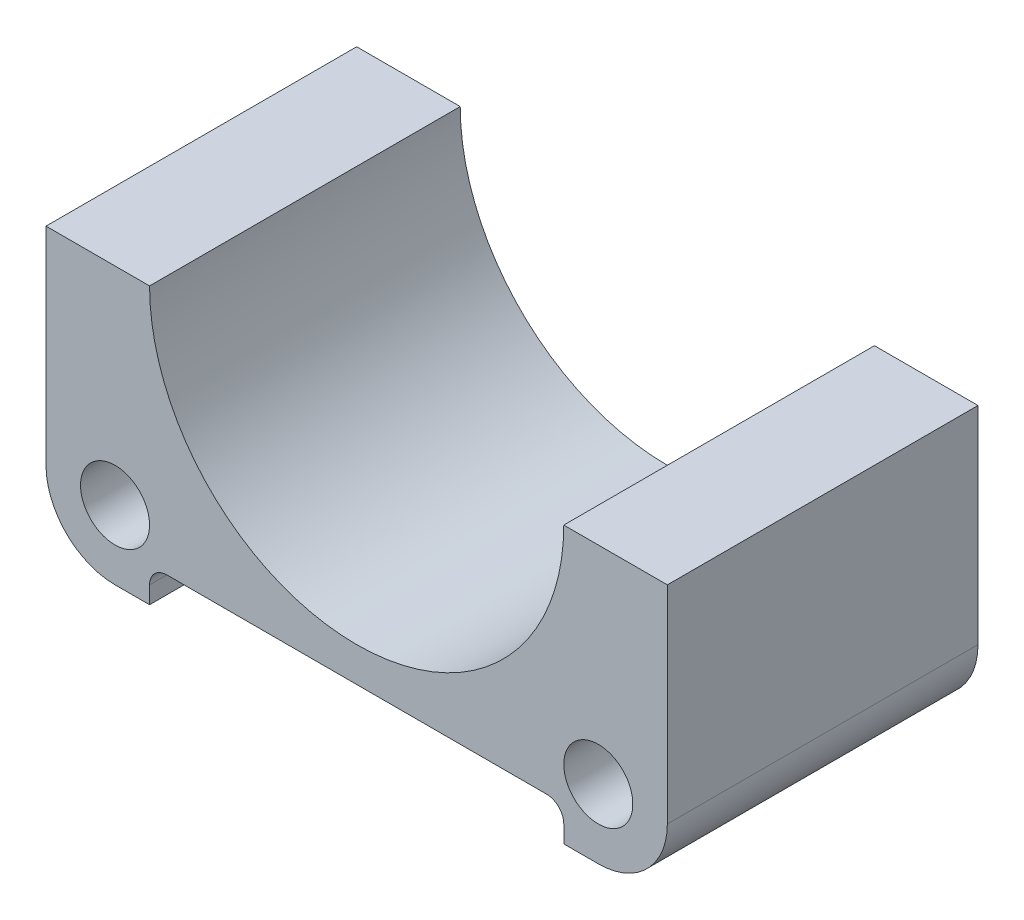
ISO-10303-21;
HEADER;
FILE_DESCRIPTION(('STEP AP214'),'2;1');
FILE_NAME('part.step','',(''),(''),'','','');
FILE_SCHEMA(('AUTOMOTIVE_DESIGN { 1 0 10303 214 1 1 1 1 }'));
ENDSEC;
DATA;
#1=APPLICATION_CONTEXT('core data for automotive mechanical design processes');
#2=APPLICATION_PROTOCOL_DEFINITION('international standard','automotive_design',2000,#1);
#3=PRODUCT_CONTEXT('',#1,'mechanical');
#4=PRODUCT('Part','Part','',(#3));
#5=PRODUCT_RELATED_PRODUCT_CATEGORY('part','',(#4));
#6=PRODUCT_DEFINITION_FORMATION('','',#4);
#7=PRODUCT_DEFINITION_CONTEXT('part definition',#1,'design');
#8=PRODUCT_DEFINITION('design','',#6,#7);
#9=PRODUCT_DEFINITION_SHAPE('','',#8);
#10=(LENGTH_UNIT() NAMED_UNIT(*) SI_UNIT(.MILLI.,.METRE.));
#11=(NAMED_UNIT(*) PLANE_ANGLE_UNIT() SI_UNIT($,.RADIAN.));
#12=(NAMED_UNIT(*) SI_UNIT($,.STERADIAN.) SOLID_ANGLE_UNIT());
#13=UNCERTAINTY_MEASURE_WITH_UNIT(LENGTH_MEASURE(1.E-05),#10,'distance_accuracy_value','');
#14=(GEOMETRIC_REPRESENTATION_CONTEXT(3) GLOBAL_UNCERTAINTY_ASSIGNED_CONTEXT((#13)) GLOBAL_UNIT_ASSIGNED_CONTEXT((#10,
#11,#12)) REPRESENTATION_CONTEXT('',''));
#15=CARTESIAN_POINT('',(0.,0.,0.));
#16=DIRECTION('',(0.,0.,1.));
#17=DIRECTION('',(1.,0.,0.));
#18=AXIS2_PLACEMENT_3D('',#15,#16,#17);
#19=CARTESIAN_POINT('',(0.,40.,90.));
#20=DIRECTION('',(0.,0.,1.));
#21=DIRECTION('',(1.,0.,0.));
#22=AXIS2_PLACEMENT_3D('',#19,#20,#21);
#23=PLANE('',#22);
#24=CARTESIAN_POINT('',(-70.,-20.,90.));
#25=DIRECTION('',(0.,0.,1.));
#26=DIRECTION('',(1.,0.,0.));
#27=AXIS2_PLACEMENT_3D('',#24,#25,#26);
#28=CIRCLE('',#27,10.);
#29=CARTESIAN_POINT('',(-80.,-20.,90.));
#30=VERTEX_POINT('',#29);
#31=EDGE_CURVE('E174',#30,#30,#28,.T.);
#32=ORIENTED_EDGE('',*,*,#31,.F.);
#33=EDGE_LOOP('',(#32));
#34=FACE_BOUND('',#33,.T.);
#35=DIRECTION('',(0.,1.,0.));
#36=VECTOR('',#35,1.);
#37=CARTESIAN_POINT('',(90.,-19.9999999999999,90.));
#38=LINE('',#37,#36);
#39=CARTESIAN_POINT('',(90.,-20.,90.));
#40=VERTEX_POINT('',#39);
#41=CARTESIAN_POINT('',(90.,40.,90.));
#42=VERTEX_POINT('',#41);
#43=EDGE_CURVE('E197',#40,#42,#38,.T.);
#44=ORIENTED_EDGE('',*,*,#43,.T.);
#45=DIRECTION('',(-1.,0.,0.));
#46=VECTOR('',#45,1.);
#47=CARTESIAN_POINT('',(60.,40.,90.));
#48=LINE('',#47,#46);
#49=CARTESIAN_POINT('',(60.,40.,90.));
#50=VERTEX_POINT('',#49);
#51=EDGE_CURVE('E115',#42,#50,#48,.T.);
#52=ORIENTED_EDGE('',*,*,#51,.T.);
#53=CARTESIAN_POINT('',(0.,40.,90.));
#54=DIRECTION('',(0.,0.,-1.));
#55=DIRECTION('',(1.,0.,0.));
#56=AXIS2_PLACEMENT_3D('',#53,#54,#55);
#57=CIRCLE('',#56,60.);
#58=CARTESIAN_POINT('',(-60.,40.,90.));
#59=VERTEX_POINT('',#58);
#60=EDGE_CURVE('E230',#50,#59,#57,.T.);
#61=ORIENTED_EDGE('',*,*,#60,.T.);
#62=DIRECTION('',(-1.,0.,0.));
#63=VECTOR('',#62,1.);
#64=CARTESIAN_POINT('',(-90.,40.,90.));
#65=LINE('',#64,#63);
#66=CARTESIAN_POINT('',(-90.,40.,90.));
#67=VERTEX_POINT('',#66);
#68=EDGE_CURVE('E249',#59,#67,#65,.T.);
#69=ORIENTED_EDGE('',*,*,#68,.T.);
#70=DIRECTION('',(0.,-1.,0.));
#71=VECTOR('',#70,1.);
#72=CARTESIAN_POINT('',(-90.,-19.9999999999999,90.));
#73=LINE('',#72,#71);
#74=CARTESIAN_POINT('',(-90.,-19.9999999999999,90.));
#75=VERTEX_POINT('',#74);
#76=EDGE_CURVE('E246',#67,#75,#73,.T.);
#77=ORIENTED_EDGE('',*,*,#76,.T.);
#78=CARTESIAN_POINT('',(-70.,-20.,90.));
#79=DIRECTION('',(0.,0.,1.));
#80=DIRECTION('',(-1.,0.,0.));
#81=AXIS2_PLACEMENT_3D('',#78,#79,#80);
#82=CIRCLE('',#81,20.);
#83=CARTESIAN_POINT('',(-69.9999999999998,-40.,90.));
#84=VERTEX_POINT('',#83);
#85=EDGE_CURVE('E248',#75,#84,#82,.T.);
#86=ORIENTED_EDGE('',*,*,#85,.T.);
#87=DIRECTION('',(1.,0.,0.));
#88=VECTOR('',#87,1.);
#89=CARTESIAN_POINT('',(-69.9999999999998,-40.,90.));
#90=LINE('',#89,#88);
#91=CARTESIAN_POINT('',(-60.,-40.,90.));
#92=VERTEX_POINT('',#91);
#93=EDGE_CURVE('E251',#84,#92,#90,.T.);
#94=ORIENTED_EDGE('',*,*,#93,.T.);
#95=DIRECTION('',(0.,1.,0.));
#96=VECTOR('',#95,1.);
#97=CARTESIAN_POINT('',(-60.,-40.,90.));
#98=LINE('',#97,#96);
#99=CARTESIAN_POINT('',(-60.,-35.,90.));
#100=VERTEX_POINT('',#99);
#101=EDGE_CURVE('E257',#92,#100,#98,.T.);
#102=ORIENTED_EDGE('',*,*,#101,.T.);
#103=CARTESIAN_POINT('',(-55.,-35.,90.));
#104=DIRECTION('',(0.,0.,-1.));
#105=DIRECTION('',(-1.,0.,0.));
#106=AXIS2_PLACEMENT_3D('',#103,#104,#105);
#107=CIRCLE('',#106,5.);
#108=CARTESIAN_POINT('',(-55.,-30.,90.));
#109=VERTEX_POINT('',#108);
#110=EDGE_CURVE('E259',#100,#109,#107,.T.);
#111=ORIENTED_EDGE('',*,*,#110,.T.);
#112=DIRECTION('',(1.,0.,0.));
#113=VECTOR('',#112,1.);
#114=CARTESIAN_POINT('',(-55.,-30.,90.));
#115=LINE('',#114,#113);
#116=CARTESIAN_POINT('',(55.,-30.,90.));
#117=VERTEX_POINT('',#116);
#118=EDGE_CURVE('E261',#109,#117,#115,.T.);
#119=ORIENTED_EDGE('',*,*,#118,.T.);
#120=CARTESIAN_POINT('',(55.,-35.,90.));
#121=DIRECTION('',(0.,0.,-1.));
#122=DIRECTION('',(-1.,0.,0.));
#123=AXIS2_PLACEMENT_3D('',#120,#121,#122);
#124=CIRCLE('',#123,5.00000000000001);
#125=CARTESIAN_POINT('',(60.,-35.,90.));
#126=VERTEX_POINT('',#125);
#127=EDGE_CURVE('E152',#117,#126,#124,.T.);
#128=ORIENTED_EDGE('',*,*,#127,.T.);
#129=DIRECTION('',(0.,-1.,0.));
#130=VECTOR('',#129,1.);
#131=CARTESIAN_POINT('',(60.,-35.,90.));
#132=LINE('',#131,#130);
#133=CARTESIAN_POINT('',(60.,-40.,90.));
#134=VERTEX_POINT('',#133);
#135=EDGE_CURVE('E146',#126,#134,#132,.T.);
#136=ORIENTED_EDGE('',*,*,#135,.T.);
#137=DIRECTION('',(1.,0.,0.));
#138=VECTOR('',#137,1.);
#139=CARTESIAN_POINT('',(60.,-40.,90.));
#140=LINE('',#139,#138);
#141=CARTESIAN_POINT('',(69.9999999999999,-40.,90.));
#142=VERTEX_POINT('',#141);
#143=EDGE_CURVE('E150',#134,#142,#140,.T.);
#144=ORIENTED_EDGE('',*,*,#143,.T.);
#145=CARTESIAN_POINT('',(70.,-20.,90.));
#146=DIRECTION('',(0.,0.,1.));
#147=DIRECTION('',(1.,0.,0.));
#148=AXIS2_PLACEMENT_3D('',#145,#146,#147);
#149=CIRCLE('',#148,20.);
#150=EDGE_CURVE('E54',#142,#40,#149,.T.);
#151=ORIENTED_EDGE('',*,*,#150,.T.);
#152=EDGE_LOOP('',(#44,#52,#61,#69,#77,#86,#94,#102,#111,#119,#128,#136,#144,#151));
#153=FACE_BOUND('',#152,.T.);
#154=CARTESIAN_POINT('',(70.,-20.,90.));
#155=DIRECTION('',(0.,0.,1.));
#156=DIRECTION('',(1.,0.,0.));
#157=AXIS2_PLACEMENT_3D('',#154,#155,#156);
#158=CIRCLE('',#157,9.99999999999999);
#159=CARTESIAN_POINT('',(60.,-20.,90.));
#160=VERTEX_POINT('',#159);
#161=EDGE_CURVE('E303',#160,#160,#158,.T.);
#162=ORIENTED_EDGE('',*,*,#161,.F.);
#163=EDGE_LOOP('',(#162));
#164=FACE_BOUND('',#163,.T.);
#165=ADVANCED_FACE('F37',(#34,#153,#164),#23,.T.);
#166=CARTESIAN_POINT('',(0.,40.,0.));
#167=DIRECTION('',(0.,0.,1.));
#168=DIRECTION('',(1.,0.,0.));
#169=AXIS2_PLACEMENT_3D('',#166,#167,#168);
#170=PLANE('',#169);
#171=DIRECTION('',(0.,1.,0.));
#172=VECTOR('',#171,1.);
#173=CARTESIAN_POINT('',(90.,-19.9999999999999,0.));
#174=LINE('',#173,#172);
#175=CARTESIAN_POINT('',(90.,-20.,0.));
#176=VERTEX_POINT('',#175);
#177=CARTESIAN_POINT('',(90.,40.,0.));
#178=VERTEX_POINT('',#177);
#179=EDGE_CURVE('E170',#176,#178,#174,.T.);
#180=ORIENTED_EDGE('',*,*,#179,.F.);
#181=CARTESIAN_POINT('',(70.,-20.,0.));
#182=DIRECTION('',(0.,0.,1.));
#183=DIRECTION('',(1.,0.,0.));
#184=AXIS2_PLACEMENT_3D('',#181,#182,#183);
#185=CIRCLE('',#184,20.);
#186=CARTESIAN_POINT('',(69.9999999999999,-40.,0.));
#187=VERTEX_POINT('',#186);
#188=EDGE_CURVE('E107',#187,#176,#185,.T.);
#189=ORIENTED_EDGE('',*,*,#188,.F.);
#190=DIRECTION('',(1.,0.,0.));
#191=VECTOR('',#190,1.);
#192=CARTESIAN_POINT('',(60.,-40.,0.));
#193=LINE('',#192,#191);
#194=CARTESIAN_POINT('',(60.,-40.,0.));
#195=VERTEX_POINT('',#194);
#196=EDGE_CURVE('E101',#195,#187,#193,.T.);
#197=ORIENTED_EDGE('',*,*,#196,.F.);
#198=DIRECTION('',(0.,-1.,0.));
#199=VECTOR('',#198,1.);
#200=CARTESIAN_POINT('',(60.,-35.,0.));
#201=LINE('',#200,#199);
#202=CARTESIAN_POINT('',(60.,-35.,0.));
#203=VERTEX_POINT('',#202);
#204=EDGE_CURVE('E160',#203,#195,#201,.T.);
#205=ORIENTED_EDGE('',*,*,#204,.F.);
#206=CARTESIAN_POINT('',(55.,-35.,0.));
#207=DIRECTION('',(0.,0.,-1.));
#208=DIRECTION('',(-1.,0.,0.));
#209=AXIS2_PLACEMENT_3D('',#206,#207,#208);
#210=CIRCLE('',#209,5.00000000000001);
#211=CARTESIAN_POINT('',(55.,-30.,0.));
#212=VERTEX_POINT('',#211);
#213=EDGE_CURVE('E192',#212,#203,#210,.T.);
#214=ORIENTED_EDGE('',*,*,#213,.F.);
#215=DIRECTION('',(1.,0.,0.));
#216=VECTOR('',#215,1.);
#217=CARTESIAN_POINT('',(-55.,-30.,0.));
#218=LINE('',#217,#216);
#219=CARTESIAN_POINT('',(-55.,-30.,0.));
#220=VERTEX_POINT('',#219);
#221=EDGE_CURVE('E190',#220,#212,#218,.T.);
#222=ORIENTED_EDGE('',*,*,#221,.F.);
#223=CARTESIAN_POINT('',(-55.,-35.,0.));
#224=DIRECTION('',(0.,0.,-1.));
#225=DIRECTION('',(-1.,0.,0.));
#226=AXIS2_PLACEMENT_3D('',#223,#224,#225);
#227=CIRCLE('',#226,5.);
#228=CARTESIAN_POINT('',(-60.,-35.,0.));
#229=VERTEX_POINT('',#228);
#230=EDGE_CURVE('E188',#229,#220,#227,.T.);
#231=ORIENTED_EDGE('',*,*,#230,.F.);
#232=DIRECTION('',(0.,1.,0.));
#233=VECTOR('',#232,1.);
#234=CARTESIAN_POINT('',(-60.,-40.,0.));
#235=LINE('',#234,#233);
#236=CARTESIAN_POINT('',(-60.,-40.,0.));
#237=VERTEX_POINT('',#236);
#238=EDGE_CURVE('E186',#237,#229,#235,.T.);
#239=ORIENTED_EDGE('',*,*,#238,.F.);
#240=DIRECTION('',(1.,0.,0.));
#241=VECTOR('',#240,1.);
#242=CARTESIAN_POINT('',(-69.9999999999998,-40.,0.));
#243=LINE('',#242,#241);
#244=CARTESIAN_POINT('',(-69.9999999999998,-40.,0.));
#245=VERTEX_POINT('',#244);
#246=EDGE_CURVE('E184',#245,#237,#243,.T.);
#247=ORIENTED_EDGE('',*,*,#246,.F.);
#248=CARTESIAN_POINT('',(-70.,-20.,0.));
#249=DIRECTION('',(0.,0.,1.));
#250=DIRECTION('',(-1.,0.,0.));
#251=AXIS2_PLACEMENT_3D('',#248,#249,#250);
#252=CIRCLE('',#251,20.);
#253=CARTESIAN_POINT('',(-90.,-19.9999999999999,0.));
#254=VERTEX_POINT('',#253);
#255=EDGE_CURVE('E182',#254,#245,#252,.T.);
#256=ORIENTED_EDGE('',*,*,#255,.F.);
#257=DIRECTION('',(0.,-1.,0.));
#258=VECTOR('',#257,1.);
#259=CARTESIAN_POINT('',(-90.,-19.9999999999999,0.));
#260=LINE('',#259,#258);
#261=CARTESIAN_POINT('',(-90.,40.,0.));
#262=VERTEX_POINT('',#261);
#263=EDGE_CURVE('E180',#262,#254,#260,.T.);
#264=ORIENTED_EDGE('',*,*,#263,.F.);
#265=DIRECTION('',(-1.,0.,0.));
#266=VECTOR('',#265,1.);
#267=CARTESIAN_POINT('',(-90.,40.,0.));
#268=LINE('',#267,#266);
#269=CARTESIAN_POINT('',(-60.,40.,0.));
#270=VERTEX_POINT('',#269);
#271=EDGE_CURVE('E178',#270,#262,#268,.T.);
#272=ORIENTED_EDGE('',*,*,#271,.F.);
#273=CARTESIAN_POINT('',(0.,40.,0.));
#274=DIRECTION('',(0.,0.,-1.));
#275=DIRECTION('',(1.,0.,0.));
#276=AXIS2_PLACEMENT_3D('',#273,#274,#275);
#277=CIRCLE('',#276,60.);
#278=CARTESIAN_POINT('',(60.,40.,0.));
#279=VERTEX_POINT('',#278);
#280=EDGE_CURVE('E176',#279,#270,#277,.T.);
#281=ORIENTED_EDGE('',*,*,#280,.F.);
#282=DIRECTION('',(-1.,0.,0.));
#283=VECTOR('',#282,1.);
#284=CARTESIAN_POINT('',(60.,40.,0.));
#285=LINE('',#284,#283);
#286=EDGE_CURVE('E173',#178,#279,#285,.T.);
#287=ORIENTED_EDGE('',*,*,#286,.F.);
#288=EDGE_LOOP('',(#180,#189,#197,#205,#214,#222,#231,#239,#247,#256,#264,#272,#281,#287));
#289=FACE_BOUND('',#288,.T.);
#290=CARTESIAN_POINT('',(-70.,-20.,0.));
#291=DIRECTION('',(0.,0.,1.));
#292=DIRECTION('',(1.,0.,0.));
#293=AXIS2_PLACEMENT_3D('',#290,#291,#292);
#294=CIRCLE('',#293,10.);
#295=CARTESIAN_POINT('',(-80.,-20.,0.));
#296=VERTEX_POINT('',#295);
#297=EDGE_CURVE('E309',#296,#296,#294,.T.);
#298=ORIENTED_EDGE('',*,*,#297,.T.);
#299=EDGE_LOOP('',(#298));
#300=FACE_BOUND('',#299,.T.);
#301=CARTESIAN_POINT('',(70.,-20.,0.));
#302=DIRECTION('',(0.,0.,1.));
#303=DIRECTION('',(1.,0.,0.));
#304=AXIS2_PLACEMENT_3D('',#301,#302,#303);
#305=CIRCLE('',#304,9.99999999999999);
#306=CARTESIAN_POINT('',(60.,-20.,0.));
#307=VERTEX_POINT('',#306);
#308=EDGE_CURVE('E306',#307,#307,#305,.T.);
#309=ORIENTED_EDGE('',*,*,#308,.T.);
#310=EDGE_LOOP('',(#309));
#311=FACE_BOUND('',#310,.T.);
#312=ADVANCED_FACE('F234',(#289,#300,#311),#170,.F.);
#313=CARTESIAN_POINT('',(90.,-19.9999999999999,90.));
#314=DIRECTION('',(-1.,0.,0.));
#315=DIRECTION('',(0.,0.,1.));
#316=AXIS2_PLACEMENT_3D('',#313,#314,#315);
#317=PLANE('',#316);
#318=ORIENTED_EDGE('',*,*,#179,.T.);
#319=DIRECTION('',(0.,0.,-1.));
#320=VECTOR('',#319,1.);
#321=CARTESIAN_POINT('',(90.,40.,90.));
#322=LINE('',#321,#320);
#323=EDGE_CURVE('E11',#42,#178,#322,.T.);
#324=ORIENTED_EDGE('',*,*,#323,.F.);
#325=ORIENTED_EDGE('',*,*,#43,.F.);
#326=DIRECTION('',(0.,0.,-1.));
#327=VECTOR('',#326,1.);
#328=CARTESIAN_POINT('',(90.,-20.,90.));
#329=LINE('',#328,#327);
#330=EDGE_CURVE('E166',#40,#176,#329,.T.);
#331=ORIENTED_EDGE('',*,*,#330,.T.);
#332=EDGE_LOOP('',(#318,#324,#325,#331));
#333=FACE_BOUND('',#332,.T.);
#334=ADVANCED_FACE('F39',(#333),#317,.F.);
#335=CARTESIAN_POINT('',(60.,40.,90.));
#336=DIRECTION('',(0.,-1.,0.));
#337=DIRECTION('',(0.,0.,-1.));
#338=AXIS2_PLACEMENT_3D('',#335,#336,#337);
#339=PLANE('',#338);
#340=ORIENTED_EDGE('',*,*,#286,.T.);
#341=DIRECTION('',(0.,0.,-1.));
#342=VECTOR('',#341,1.);
#343=CARTESIAN_POINT('',(60.,40.,90.));
#344=LINE('',#343,#342);
#345=EDGE_CURVE('E46',#50,#279,#344,.T.);
#346=ORIENTED_EDGE('',*,*,#345,.F.);
#347=ORIENTED_EDGE('',*,*,#51,.F.);
#348=ORIENTED_EDGE('',*,*,#323,.T.);
#349=EDGE_LOOP('',(#340,#346,#347,#348));
#350=FACE_BOUND('',#349,.T.);
#351=ADVANCED_FACE('F434',(#350),#339,.F.);
#352=CARTESIAN_POINT('',(0.,40.,90.));
#353=DIRECTION('',(0.,0.,-1.));
#354=DIRECTION('',(-1.,0.,0.));
#355=AXIS2_PLACEMENT_3D('',#352,#353,#354);
#356=CYLINDRICAL_SURFACE('',#355,60.);
#357=ORIENTED_EDGE('',*,*,#280,.T.);
#358=DIRECTION('',(0.,0.,-1.));
#359=VECTOR('',#358,1.);
#360=CARTESIAN_POINT('',(-60.,40.,90.));
#361=LINE('',#360,#359);
#362=EDGE_CURVE('E222',#59,#270,#361,.T.);
#363=ORIENTED_EDGE('',*,*,#362,.F.);
#364=ORIENTED_EDGE('',*,*,#60,.F.);
#365=ORIENTED_EDGE('',*,*,#345,.T.);
#366=EDGE_LOOP('',(#357,#363,#364,#365));
#367=FACE_BOUND('',#366,.T.);
#368=ADVANCED_FACE('F228',(#367),#356,.F.);
#369=CARTESIAN_POINT('',(-90.,40.,90.));
#370=DIRECTION('',(0.,-1.,0.));
#371=DIRECTION('',(0.,0.,-1.));
#372=AXIS2_PLACEMENT_3D('',#369,#370,#371);
#373=PLANE('',#372);
#374=ORIENTED_EDGE('',*,*,#271,.T.);
#375=DIRECTION('',(0.,0.,-1.));
#376=VECTOR('',#375,1.);
#377=CARTESIAN_POINT('',(-90.,40.,90.));
#378=LINE('',#377,#376);
#379=EDGE_CURVE('E219',#67,#262,#378,.T.);
#380=ORIENTED_EDGE('',*,*,#379,.F.);
#381=ORIENTED_EDGE('',*,*,#68,.F.);
#382=ORIENTED_EDGE('',*,*,#362,.T.);
#383=EDGE_LOOP('',(#374,#380,#381,#382));
#384=FACE_BOUND('',#383,.T.);
#385=ADVANCED_FACE('F240',(#384),#373,.F.);
#386=CARTESIAN_POINT('',(-90.,-19.9999999999999,90.));
#387=DIRECTION('',(1.,0.,0.));
#388=DIRECTION('',(0.,0.,-1.));
#389=AXIS2_PLACEMENT_3D('',#386,#387,#388);
#390=PLANE('',#389);
#391=ORIENTED_EDGE('',*,*,#263,.T.);
#392=DIRECTION('',(0.,0.,-1.));
#393=VECTOR('',#392,1.);
#394=CARTESIAN_POINT('',(-90.,-19.9999999999999,90.));
#395=LINE('',#394,#393);
#396=EDGE_CURVE('E216',#75,#254,#395,.T.);
#397=ORIENTED_EDGE('',*,*,#396,.F.);
#398=ORIENTED_EDGE('',*,*,#76,.F.);
#399=ORIENTED_EDGE('',*,*,#379,.T.);
#400=EDGE_LOOP('',(#391,#397,#398,#399));
#401=FACE_BOUND('',#400,.T.);
#402=ADVANCED_FACE('F244',(#401),#390,.F.);
#403=CARTESIAN_POINT('',(-70.,-20.,90.));
#404=DIRECTION('',(0.,0.,-1.));
#405=DIRECTION('',(-1.,0.,0.));
#406=AXIS2_PLACEMENT_3D('',#403,#404,#405);
#407=CYLINDRICAL_SURFACE('',#406,20.);
#408=ORIENTED_EDGE('',*,*,#255,.T.);
#409=DIRECTION('',(0.,0.,-1.));
#410=VECTOR('',#409,1.);
#411=CARTESIAN_POINT('',(-69.9999999999998,-40.,90.));
#412=LINE('',#411,#410);
#413=EDGE_CURVE('E213',#84,#245,#412,.T.);
#414=ORIENTED_EDGE('',*,*,#413,.F.);
#415=ORIENTED_EDGE('',*,*,#85,.F.);
#416=ORIENTED_EDGE('',*,*,#396,.T.);
#417=EDGE_LOOP('',(#408,#414,#415,#416));
#418=FACE_BOUND('',#417,.T.);
#419=ADVANCED_FACE('F395',(#418),#407,.T.);
#420=CARTESIAN_POINT('',(-69.9999999999998,-40.,90.));
#421=DIRECTION('',(0.,1.,0.));
#422=DIRECTION('',(0.,0.,1.));
#423=AXIS2_PLACEMENT_3D('',#420,#421,#422);
#424=PLANE('',#423);
#425=ORIENTED_EDGE('',*,*,#246,.T.);
#426=DIRECTION('',(0.,0.,-1.));
#427=VECTOR('',#426,1.);
#428=CARTESIAN_POINT('',(-60.,-40.,90.));
#429=LINE('',#428,#427);
#430=EDGE_CURVE('E210',#92,#237,#429,.T.);
#431=ORIENTED_EDGE('',*,*,#430,.F.);
#432=ORIENTED_EDGE('',*,*,#93,.F.);
#433=ORIENTED_EDGE('',*,*,#413,.T.);
#434=EDGE_LOOP('',(#425,#431,#432,#433));
#435=FACE_BOUND('',#434,.T.);
#436=ADVANCED_FACE('F384',(#435),#424,.F.);
#437=CARTESIAN_POINT('',(-60.,-40.,90.));
#438=DIRECTION('',(-1.,0.,0.));
#439=DIRECTION('',(0.,-1.,0.));
#440=AXIS2_PLACEMENT_3D('',#437,#438,#439);
#441=PLANE('',#440);
#442=ORIENTED_EDGE('',*,*,#238,.T.);
#443=DIRECTION('',(0.,0.,-1.));
#444=VECTOR('',#443,1.);
#445=CARTESIAN_POINT('',(-60.,-35.,90.));
#446=LINE('',#445,#444);
#447=EDGE_CURVE('E207',#100,#229,#446,.T.);
#448=ORIENTED_EDGE('',*,*,#447,.F.);
#449=ORIENTED_EDGE('',*,*,#101,.F.);
#450=ORIENTED_EDGE('',*,*,#430,.T.);
#451=EDGE_LOOP('',(#442,#448,#449,#450));
#452=FACE_BOUND('',#451,.T.);
#453=ADVANCED_FACE('F373',(#452),#441,.F.);
#454=CARTESIAN_POINT('',(-55.,-35.,90.));
#455=DIRECTION('',(0.,0.,-1.));
#456=DIRECTION('',(-1.,0.,0.));
#457=AXIS2_PLACEMENT_3D('',#454,#455,#456);
#458=CYLINDRICAL_SURFACE('',#457,5.);
#459=ORIENTED_EDGE('',*,*,#230,.T.);
#460=DIRECTION('',(0.,0.,-1.));
#461=VECTOR('',#460,1.);
#462=CARTESIAN_POINT('',(-55.,-30.,90.));
#463=LINE('',#462,#461);
#464=EDGE_CURVE('E204',#109,#220,#463,.T.);
#465=ORIENTED_EDGE('',*,*,#464,.F.);
#466=ORIENTED_EDGE('',*,*,#110,.F.);
#467=ORIENTED_EDGE('',*,*,#447,.T.);
#468=EDGE_LOOP('',(#459,#465,#466,#467));
#469=FACE_BOUND('',#468,.T.);
#470=ADVANCED_FACE('F363',(#469),#458,.F.);
#471=CARTESIAN_POINT('',(-55.,-30.,90.));
#472=DIRECTION('',(0.,1.,0.));
#473=DIRECTION('',(-1.,0.,0.));
#474=AXIS2_PLACEMENT_3D('',#471,#472,#473);
#475=PLANE('',#474);
#476=ORIENTED_EDGE('',*,*,#221,.T.);
#477=DIRECTION('',(0.,0.,-1.));
#478=VECTOR('',#477,1.);
#479=CARTESIAN_POINT('',(55.,-30.,90.));
#480=LINE('',#479,#478);
#481=EDGE_CURVE('E201',#117,#212,#480,.T.);
#482=ORIENTED_EDGE('',*,*,#481,.F.);
#483=ORIENTED_EDGE('',*,*,#118,.F.);
#484=ORIENTED_EDGE('',*,*,#464,.T.);
#485=EDGE_LOOP('',(#476,#482,#483,#484));
#486=FACE_BOUND('',#485,.T.);
#487=ADVANCED_FACE('F267',(#486),#475,.F.);
#488=CARTESIAN_POINT('',(55.,-35.,90.));
#489=DIRECTION('',(0.,0.,-1.));
#490=DIRECTION('',(-1.,0.,0.));
#491=AXIS2_PLACEMENT_3D('',#488,#489,#490);
#492=CYLINDRICAL_SURFACE('',#491,5.00000000000001);
#493=ORIENTED_EDGE('',*,*,#213,.T.);
#494=DIRECTION('',(0.,0.,-1.));
#495=VECTOR('',#494,1.);
#496=CARTESIAN_POINT('',(60.,-35.,90.));
#497=LINE('',#496,#495);
#498=EDGE_CURVE('E161',#126,#203,#497,.T.);
#499=ORIENTED_EDGE('',*,*,#498,.F.);
#500=ORIENTED_EDGE('',*,*,#127,.F.);
#501=ORIENTED_EDGE('',*,*,#481,.T.);
#502=EDGE_LOOP('',(#493,#499,#500,#501));
#503=FACE_BOUND('',#502,.T.);
#504=ADVANCED_FACE('F271',(#503),#492,.F.);
#505=CARTESIAN_POINT('',(60.,-35.,90.));
#506=DIRECTION('',(1.,0.,0.));
#507=DIRECTION('',(0.,0.,-1.));
#508=AXIS2_PLACEMENT_3D('',#505,#506,#507);
#509=PLANE('',#508);
#510=ORIENTED_EDGE('',*,*,#204,.T.);
#511=DIRECTION('',(0.,0.,-1.));
#512=VECTOR('',#511,1.);
#513=CARTESIAN_POINT('',(60.,-40.,90.));
#514=LINE('',#513,#512);
#515=EDGE_CURVE('E157',#134,#195,#514,.T.);
#516=ORIENTED_EDGE('',*,*,#515,.F.);
#517=ORIENTED_EDGE('',*,*,#135,.F.);
#518=ORIENTED_EDGE('',*,*,#498,.T.);
#519=EDGE_LOOP('',(#510,#516,#517,#518));
#520=FACE_BOUND('',#519,.T.);
#521=ADVANCED_FACE('F158',(#520),#509,.F.);
#522=CARTESIAN_POINT('',(60.,-40.,90.));
#523=DIRECTION('',(0.,1.,0.));
#524=DIRECTION('',(0.,0.,1.));
#525=AXIS2_PLACEMENT_3D('',#522,#523,#524);
#526=PLANE('',#525);
#527=ORIENTED_EDGE('',*,*,#196,.T.);
#528=DIRECTION('',(0.,0.,-1.));
#529=VECTOR('',#528,1.);
#530=CARTESIAN_POINT('',(69.9999999999999,-40.,90.));
#531=LINE('',#530,#529);
#532=EDGE_CURVE('E162',#142,#187,#531,.T.);
#533=ORIENTED_EDGE('',*,*,#532,.F.);
#534=ORIENTED_EDGE('',*,*,#143,.F.);
#535=ORIENTED_EDGE('',*,*,#515,.T.);
#536=EDGE_LOOP('',(#527,#533,#534,#535));
#537=FACE_BOUND('',#536,.T.);
#538=ADVANCED_FACE('F164',(#537),#526,.F.);
#539=CARTESIAN_POINT('',(70.,-20.,90.));
#540=DIRECTION('',(0.,0.,-1.));
#541=DIRECTION('',(-1.,0.,0.));
#542=AXIS2_PLACEMENT_3D('',#539,#540,#541);
#543=CYLINDRICAL_SURFACE('',#542,20.);
#544=ORIENTED_EDGE('',*,*,#188,.T.);
#545=ORIENTED_EDGE('',*,*,#330,.F.);
#546=ORIENTED_EDGE('',*,*,#150,.F.);
#547=ORIENTED_EDGE('',*,*,#532,.T.);
#548=EDGE_LOOP('',(#544,#545,#546,#547));
#549=FACE_BOUND('',#548,.T.);
#550=ADVANCED_FACE('F275',(#549),#543,.T.);
#551=CARTESIAN_POINT('',(-70.,-20.,90.));
#552=DIRECTION('',(0.,0.,-1.));
#553=DIRECTION('',(-1.,0.,0.));
#554=AXIS2_PLACEMENT_3D('',#551,#552,#553);
#555=CYLINDRICAL_SURFACE('',#554,10.);
#556=CARTESIAN_POINT('',(-80.,-20.,90.));
#557=CARTESIAN_POINT('',(-80.,-20.,89.0625));
#558=CARTESIAN_POINT('',(-80.,-20.,88.125));
#559=CARTESIAN_POINT('',(-80.,-20.,86.25));
#560=CARTESIAN_POINT('',(-80.,-20.,85.3125));
#561=CARTESIAN_POINT('',(-80.,-20.,83.4375));
#562=CARTESIAN_POINT('',(-80.,-20.,82.5));
#563=CARTESIAN_POINT('',(-80.,-20.,80.625));
#564=CARTESIAN_POINT('',(-80.,-20.,79.6875));
#565=CARTESIAN_POINT('',(-80.,-20.,77.8125));
#566=CARTESIAN_POINT('',(-80.,-20.,76.875));
#567=CARTESIAN_POINT('',(-80.,-20.,75.));
#568=CARTESIAN_POINT('',(-80.,-20.,74.0625));
#569=CARTESIAN_POINT('',(-80.,-20.,72.1875));
#570=CARTESIAN_POINT('',(-80.,-20.,71.25));
#571=CARTESIAN_POINT('',(-80.,-20.,69.375));
#572=CARTESIAN_POINT('',(-80.,-20.,68.4375));
#573=CARTESIAN_POINT('',(-80.,-20.,66.5625));
#574=CARTESIAN_POINT('',(-80.,-20.,65.625));
#575=CARTESIAN_POINT('',(-80.,-20.,63.75));
#576=CARTESIAN_POINT('',(-80.,-20.,62.8125));
#577=CARTESIAN_POINT('',(-80.,-20.,60.9375));
#578=CARTESIAN_POINT('',(-80.,-20.,60.));
#579=CARTESIAN_POINT('',(-80.,-20.,58.125));
#580=CARTESIAN_POINT('',(-80.,-20.,57.1875));
#581=CARTESIAN_POINT('',(-80.,-20.,55.3125));
#582=CARTESIAN_POINT('',(-80.,-20.,54.375));
#583=CARTESIAN_POINT('',(-80.,-20.,52.5));
#584=CARTESIAN_POINT('',(-80.,-20.,51.5625));
#585=CARTESIAN_POINT('',(-80.,-20.,49.6875));
#586=CARTESIAN_POINT('',(-80.,-20.,48.75));
#587=CARTESIAN_POINT('',(-80.,-20.,46.875));
#588=CARTESIAN_POINT('',(-80.,-20.,45.9375));
#589=CARTESIAN_POINT('',(-80.,-20.,44.0625));
#590=CARTESIAN_POINT('',(-80.,-20.,43.125));
#591=CARTESIAN_POINT('',(-80.,-20.,41.25));
#592=CARTESIAN_POINT('',(-80.,-20.,40.3125));
#593=CARTESIAN_POINT('',(-80.,-20.,38.4375));
#594=CARTESIAN_POINT('',(-80.,-20.,37.5));
#595=CARTESIAN_POINT('',(-80.,-20.,35.625));
#596=CARTESIAN_POINT('',(-80.,-20.,34.6875));
#597=CARTESIAN_POINT('',(-80.,-20.,32.8125));
#598=CARTESIAN_POINT('',(-80.,-20.,31.875));
#599=CARTESIAN_POINT('',(-80.,-20.,30.));
#600=CARTESIAN_POINT('',(-80.,-20.,29.0625));
#601=CARTESIAN_POINT('',(-80.,-20.,27.1875));
#602=CARTESIAN_POINT('',(-80.,-20.,26.25));
#603=CARTESIAN_POINT('',(-80.,-20.,24.375));
#604=CARTESIAN_POINT('',(-80.,-20.,23.4375));
#605=CARTESIAN_POINT('',(-80.,-20.,21.5625));
#606=CARTESIAN_POINT('',(-80.,-20.,20.625));
#607=CARTESIAN_POINT('',(-80.,-20.,18.75));
#608=CARTESIAN_POINT('',(-80.,-20.,17.8125));
#609=CARTESIAN_POINT('',(-80.,-20.,15.9375));
#610=CARTESIAN_POINT('',(-80.,-20.,15.));
#611=CARTESIAN_POINT('',(-80.,-20.,13.125));
#612=CARTESIAN_POINT('',(-80.,-20.,12.1875));
#613=CARTESIAN_POINT('',(-80.,-20.,10.3125));
#614=CARTESIAN_POINT('',(-80.,-20.,9.37499999999999));
#615=CARTESIAN_POINT('',(-80.,-20.,7.49999999999999));
#616=CARTESIAN_POINT('',(-80.,-20.,6.56249999999999));
#617=CARTESIAN_POINT('',(-80.,-20.,4.68749999999999));
#618=CARTESIAN_POINT('',(-80.,-20.,3.74999999999998));
#619=CARTESIAN_POINT('',(-80.,-20.,1.87499999999998));
#620=CARTESIAN_POINT('',(-80.,-20.,0.937499999999986));
#621=CARTESIAN_POINT('',(-80.,-20.,0.));
#622=B_SPLINE_CURVE_WITH_KNOTS('',3,(#556,#557,#558,#559,#560,#561,#562,#563,#564,#565,#566,
#567,#568,#569,#570,#571,#572,#573,#574,#575,#576,#577,#578,#579,#580,#581,#582,#583,#584,#585,
#586,#587,#588,#589,#590,#591,#592,#593,#594,#595,#596,#597,#598,#599,#600,#601,#602,#603,#604,
#605,#606,#607,#608,#609,#610,#611,#612,#613,#614,#615,#616,#617,#618,#619,#620,#621),
.UNSPECIFIED.,.F.,.F.,(4,2,2,2,2,2,2,2,2,2,2,2,2,2,2,2,2,2,2,2,2,2,2,2,2,2,2,2,2,2,2,2,4),(0.,
2.81250000000001,5.62500000000001,8.43750000000001,11.25,14.0625,16.875,19.6875,22.5,25.3125,
28.125,30.9375,33.75,36.5625,39.375,42.1875,45.,47.8125,50.625,53.4375,56.25,59.0625,61.875,
64.6875,67.5,70.3125,73.125,75.9375,78.75,81.5625,84.375,87.1875,90.),.UNSPECIFIED.);
#623=EDGE_CURVE('BSEAM277',#30,#296,#622,.T.);
#624=ORIENTED_EDGE('',*,*,#31,.T.);
#625=ORIENTED_EDGE('',*,*,#297,.F.);
#626=ORIENTED_EDGE('',*,*,#623,.T.);
#627=ORIENTED_EDGE('',*,*,#623,.F.);
#628=EDGE_LOOP('',(#624,#626,#625,#627));
#629=FACE_BOUND('',#628,.T.);
#630=ADVANCED_FACE('F277',(#629),#555,.F.);
#631=CARTESIAN_POINT('',(70.,-20.,90.));
#632=DIRECTION('',(0.,0.,-1.));
#633=DIRECTION('',(-1.,0.,0.));
#634=AXIS2_PLACEMENT_3D('',#631,#632,#633);
#635=CYLINDRICAL_SURFACE('',#634,9.99999999999999);
#636=CARTESIAN_POINT('',(60.,-20.,90.));
#637=CARTESIAN_POINT('',(60.,-20.,89.0625));
#638=CARTESIAN_POINT('',(60.,-20.,88.125));
#639=CARTESIAN_POINT('',(60.,-20.,86.25));
#640=CARTESIAN_POINT('',(60.,-20.,85.3125));
#641=CARTESIAN_POINT('',(60.,-20.,83.4375));
#642=CARTESIAN_POINT('',(60.,-20.,82.5));
#643=CARTESIAN_POINT('',(60.,-20.,80.625));
#644=CARTESIAN_POINT('',(60.,-20.,79.6875));
#645=CARTESIAN_POINT('',(60.,-20.,77.8125));
#646=CARTESIAN_POINT('',(60.,-20.,76.875));
#647=CARTESIAN_POINT('',(60.,-20.,75.));
#648=CARTESIAN_POINT('',(60.,-20.,74.0625));
#649=CARTESIAN_POINT('',(60.,-20.,72.1875));
#650=CARTESIAN_POINT('',(60.,-20.,71.25));
#651=CARTESIAN_POINT('',(60.,-20.,69.375));
#652=CARTESIAN_POINT('',(60.,-20.,68.4375));
#653=CARTESIAN_POINT('',(60.,-20.,66.5625));
#654=CARTESIAN_POINT('',(60.,-20.,65.625));
#655=CARTESIAN_POINT('',(60.,-20.,63.75));
#656=CARTESIAN_POINT('',(60.,-20.,62.8125));
#657=CARTESIAN_POINT('',(60.,-20.,60.9375));
#658=CARTESIAN_POINT('',(60.,-20.,60.));
#659=CARTESIAN_POINT('',(60.,-20.,58.125));
#660=CARTESIAN_POINT('',(60.,-20.,57.1875));
#661=CARTESIAN_POINT('',(60.,-20.,55.3125));
#662=CARTESIAN_POINT('',(60.,-20.,54.375));
#663=CARTESIAN_POINT('',(60.,-20.,52.5));
#664=CARTESIAN_POINT('',(60.,-20.,51.5625));
#665=CARTESIAN_POINT('',(60.,-20.,49.6875));
#666=CARTESIAN_POINT('',(60.,-20.,48.75));
#667=CARTESIAN_POINT('',(60.,-20.,46.875));
#668=CARTESIAN_POINT('',(60.,-20.,45.9375));
#669=CARTESIAN_POINT('',(60.,-20.,44.0625));
#670=CARTESIAN_POINT('',(60.,-20.,43.125));
#671=CARTESIAN_POINT('',(60.,-20.,41.25));
#672=CARTESIAN_POINT('',(60.,-20.,40.3125));
#673=CARTESIAN_POINT('',(60.,-20.,38.4375));
#674=CARTESIAN_POINT('',(60.,-20.,37.5));
#675=CARTESIAN_POINT('',(60.,-20.,35.625));
#676=CARTESIAN_POINT('',(60.,-20.,34.6875));
#677=CARTESIAN_POINT('',(60.,-20.,32.8125));
#678=CARTESIAN_POINT('',(60.,-20.,31.875));
#679=CARTESIAN_POINT('',(60.,-20.,30.));
#680=CARTESIAN_POINT('',(60.,-20.,29.0625));
#681=CARTESIAN_POINT('',(60.,-20.,27.1875));
#682=CARTESIAN_POINT('',(60.,-20.,26.25));
#683=CARTESIAN_POINT('',(60.,-20.,24.375));
#684=CARTESIAN_POINT('',(60.,-20.,23.4375));
#685=CARTESIAN_POINT('',(60.,-20.,21.5625));
#686=CARTESIAN_POINT('',(60.,-20.,20.625));
#687=CARTESIAN_POINT('',(60.,-20.,18.75));
#688=CARTESIAN_POINT('',(60.,-20.,17.8125));
#689=CARTESIAN_POINT('',(60.,-20.,15.9375));
#690=CARTESIAN_POINT('',(60.,-20.,15.));
#691=CARTESIAN_POINT('',(60.,-20.,13.125));
#692=CARTESIAN_POINT('',(60.,-20.,12.1875));
#693=CARTESIAN_POINT('',(60.,-20.,10.3125));
#694=CARTESIAN_POINT('',(60.,-20.,9.37499999999999));
#695=CARTESIAN_POINT('',(60.,-20.,7.49999999999999));
#696=CARTESIAN_POINT('',(60.,-20.,6.56249999999999));
#697=CARTESIAN_POINT('',(60.,-20.,4.68749999999999));
#698=CARTESIAN_POINT('',(60.,-20.,3.74999999999998));
#699=CARTESIAN_POINT('',(60.,-20.,1.87499999999998));
#700=CARTESIAN_POINT('',(60.,-20.,0.937499999999986));
#701=CARTESIAN_POINT('',(60.,-20.,0.));
#702=B_SPLINE_CURVE_WITH_KNOTS('',3,(#636,#637,#638,#639,#640,#641,#642,#643,#644,#645,#646,
#647,#648,#649,#650,#651,#652,#653,#654,#655,#656,#657,#658,#659,#660,#661,#662,#663,#664,#665,
#666,#667,#668,#669,#670,#671,#672,#673,#674,#675,#676,#677,#678,#679,#680,#681,#682,#683,#684,
#685,#686,#687,#688,#689,#690,#691,#692,#693,#694,#695,#696,#697,#698,#699,#700,#701),
.UNSPECIFIED.,.F.,.F.,(4,2,2,2,2,2,2,2,2,2,2,2,2,2,2,2,2,2,2,2,2,2,2,2,2,2,2,2,2,2,2,2,4),(0.,
2.81250000000001,5.62500000000001,8.43750000000001,11.25,14.0625,16.875,19.6875,22.5,25.3125,
28.125,30.9375,33.75,36.5625,39.375,42.1875,45.,47.8125,50.625,53.4375,56.25,59.0625,61.875,
64.6875,67.5,70.3125,73.125,75.9375,78.75,81.5625,84.375,87.1875,90.),.UNSPECIFIED.);
#703=EDGE_CURVE('BSEAM283',#160,#307,#702,.T.);
#704=ORIENTED_EDGE('',*,*,#161,.T.);
#705=ORIENTED_EDGE('',*,*,#308,.F.);
#706=ORIENTED_EDGE('',*,*,#703,.T.);
#707=ORIENTED_EDGE('',*,*,#703,.F.);
#708=EDGE_LOOP('',(#704,#706,#705,#707));
#709=FACE_BOUND('',#708,.T.);
#710=ADVANCED_FACE('F283',(#709),#635,.F.);
#711=CLOSED_SHELL('',(#165,#312,#334,#351,#368,#385,#402,#419,#436,#453,#470,#487,#504,#521,
#538,#550,#630,#710));
#712=MANIFOLD_SOLID_BREP('B2',#711);
#713=ADVANCED_BREP_SHAPE_REPRESENTATION('',(#18,#712),#14);
#714=SHAPE_DEFINITION_REPRESENTATION(#9,#713);
ENDSEC;
END-ISO-10303-21;
